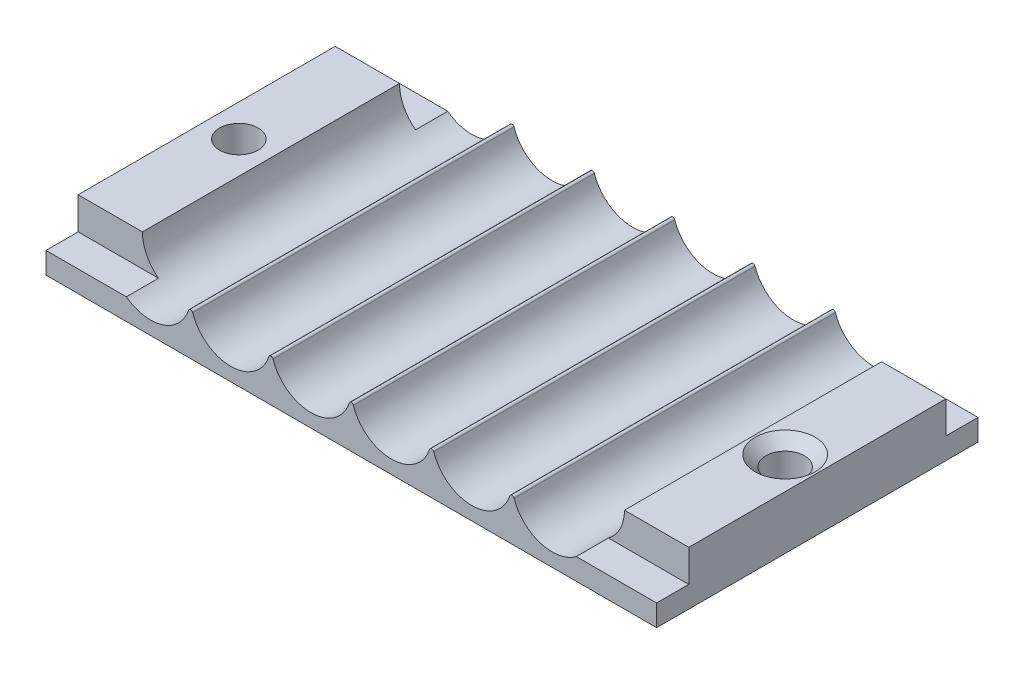
ISO-10303-21;
HEADER;
FILE_DESCRIPTION(('STEP AP214'),'2;1');
FILE_NAME('part.step','',(''),(''),'','','');
FILE_SCHEMA(('AUTOMOTIVE_DESIGN { 1 0 10303 214 1 1 1 1 }'));
ENDSEC;
DATA;
#1=APPLICATION_CONTEXT('core data for automotive mechanical design processes');
#2=APPLICATION_PROTOCOL_DEFINITION('international standard','automotive_design',2000,#1);
#3=PRODUCT_CONTEXT('',#1,'mechanical');
#4=PRODUCT('Part','Part','',(#3));
#5=PRODUCT_RELATED_PRODUCT_CATEGORY('part','',(#4));
#6=PRODUCT_DEFINITION_FORMATION('','',#4);
#7=PRODUCT_DEFINITION_CONTEXT('part definition',#1,'design');
#8=PRODUCT_DEFINITION('design','',#6,#7);
#9=PRODUCT_DEFINITION_SHAPE('','',#8);
#10=(LENGTH_UNIT() NAMED_UNIT(*) SI_UNIT(.MILLI.,.METRE.));
#11=(NAMED_UNIT(*) PLANE_ANGLE_UNIT() SI_UNIT($,.RADIAN.));
#12=(NAMED_UNIT(*) SI_UNIT($,.STERADIAN.) SOLID_ANGLE_UNIT());
#13=UNCERTAINTY_MEASURE_WITH_UNIT(LENGTH_MEASURE(1.E-05),#10,'distance_accuracy_value','');
#14=(GEOMETRIC_REPRESENTATION_CONTEXT(3) GLOBAL_UNCERTAINTY_ASSIGNED_CONTEXT((#13)) GLOBAL_UNIT_ASSIGNED_CONTEXT((#10,
#11,#12)) REPRESENTATION_CONTEXT('',''));
#15=CARTESIAN_POINT('',(0.,0.,0.));
#16=DIRECTION('',(0.,0.,1.));
#17=DIRECTION('',(1.,0.,0.));
#18=AXIS2_PLACEMENT_3D('',#15,#16,#17);
#19=CARTESIAN_POINT('',(-22.5,5.00000000000001,15.));
#20=DIRECTION('',(0.,-1.,0.));
#21=DIRECTION('',(1.,0.,0.));
#22=AXIS2_PLACEMENT_3D('',#19,#20,#21);
#23=PLANE('',#22);
#24=CARTESIAN_POINT('',(-25.5,5.00000000000001,0.));
#25=DIRECTION('',(0.,1.,0.));
#26=DIRECTION('',(-1.,0.,0.));
#27=AXIS2_PLACEMENT_3D('',#24,#25,#26);
#28=CIRCLE('',#27,1.8);
#29=CARTESIAN_POINT('',(-27.3,5.00000000000001,0.));
#30=VERTEX_POINT('',#29);
#31=EDGE_CURVE('E382',#30,#30,#28,.T.);
#32=ORIENTED_EDGE('',*,*,#31,.F.);
#33=EDGE_LOOP('',(#32));
#34=FACE_BOUND('',#33,.T.);
#35=DIRECTION('',(-1.,0.,0.));
#36=VECTOR('',#35,1.);
#37=CARTESIAN_POINT('',(-28.5,5.00000000000001,12.));
#38=LINE('',#37,#36);
#39=CARTESIAN_POINT('',(-22.5,5.00000000000001,12.));
#40=VERTEX_POINT('',#39);
#41=CARTESIAN_POINT('',(-28.5,5.00000000000001,12.));
#42=VERTEX_POINT('',#41);
#43=EDGE_CURVE('E202',#40,#42,#38,.T.);
#44=ORIENTED_EDGE('',*,*,#43,.F.);
#45=DIRECTION('',(0.,0.,-1.));
#46=VECTOR('',#45,1.);
#47=CARTESIAN_POINT('',(-22.5,5.00000000000001,15.));
#48=LINE('',#47,#46);
#49=CARTESIAN_POINT('',(-22.5,5.00000000000001,-12.));
#50=VERTEX_POINT('',#49);
#51=EDGE_CURVE('E226',#40,#50,#48,.T.);
#52=ORIENTED_EDGE('',*,*,#51,.T.);
#53=DIRECTION('',(1.,0.,0.));
#54=VECTOR('',#53,1.);
#55=CARTESIAN_POINT('',(-28.5,5.00000000000001,-12.));
#56=LINE('',#55,#54);
#57=CARTESIAN_POINT('',(-28.5,5.00000000000001,-12.));
#58=VERTEX_POINT('',#57);
#59=EDGE_CURVE('E220',#58,#50,#56,.T.);
#60=ORIENTED_EDGE('',*,*,#59,.F.);
#61=DIRECTION('',(0.,0.,-1.));
#62=VECTOR('',#61,1.);
#63=CARTESIAN_POINT('',(-28.5,5.00000000000001,15.));
#64=LINE('',#63,#62);
#65=EDGE_CURVE('E221',#42,#58,#64,.T.);
#66=ORIENTED_EDGE('',*,*,#65,.F.);
#67=EDGE_LOOP('',(#44,#52,#60,#66));
#68=FACE_BOUND('',#67,.T.);
#69=ADVANCED_FACE('F41',(#34,#68),#23,.F.);
#70=CARTESIAN_POINT('',(-28.5,5.00000000000001,15.));
#71=DIRECTION('',(1.,0.,0.));
#72=DIRECTION('',(0.,0.,-1.));
#73=AXIS2_PLACEMENT_3D('',#70,#71,#72);
#74=PLANE('',#73);
#75=DIRECTION('',(0.,0.,1.));
#76=VECTOR('',#75,1.);
#77=CARTESIAN_POINT('',(-28.5,2.00000000000001,15.));
#78=LINE('',#77,#76);
#79=CARTESIAN_POINT('',(-28.5,2.00000000000001,12.));
#80=VERTEX_POINT('',#79);
#81=CARTESIAN_POINT('',(-28.5,2.00000000000001,15.));
#82=VERTEX_POINT('',#81);
#83=EDGE_CURVE('E217',#80,#82,#78,.T.);
#84=ORIENTED_EDGE('',*,*,#83,.F.);
#85=DIRECTION('',(0.,1.,0.));
#86=VECTOR('',#85,1.);
#87=CARTESIAN_POINT('',(-28.5,2.00000000000001,12.));
#88=LINE('',#87,#86);
#89=EDGE_CURVE('E207',#80,#42,#88,.T.);
#90=ORIENTED_EDGE('',*,*,#89,.T.);
#91=ORIENTED_EDGE('',*,*,#65,.T.);
#92=DIRECTION('',(0.,1.,0.));
#93=VECTOR('',#92,1.);
#94=CARTESIAN_POINT('',(-28.5,2.00000000000001,-12.));
#95=LINE('',#94,#93);
#96=CARTESIAN_POINT('',(-28.5,2.00000000000001,-12.));
#97=VERTEX_POINT('',#96);
#98=EDGE_CURVE('E447',#97,#58,#95,.T.);
#99=ORIENTED_EDGE('',*,*,#98,.F.);
#100=DIRECTION('',(0.,0.,1.));
#101=VECTOR('',#100,1.);
#102=CARTESIAN_POINT('',(-28.5,2.00000000000001,-15.));
#103=LINE('',#102,#101);
#104=CARTESIAN_POINT('',(-28.5,2.00000000000001,-15.));
#105=VERTEX_POINT('',#104);
#106=EDGE_CURVE('E444',#105,#97,#103,.T.);
#107=ORIENTED_EDGE('',*,*,#106,.F.);
#108=DIRECTION('',(0.,-1.,0.));
#109=VECTOR('',#108,1.);
#110=CARTESIAN_POINT('',(-28.5,5.00000000000001,-15.));
#111=LINE('',#110,#109);
#112=CARTESIAN_POINT('',(-28.5,0.,-15.));
#113=VERTEX_POINT('',#112);
#114=EDGE_CURVE('E385',#105,#113,#111,.T.);
#115=ORIENTED_EDGE('',*,*,#114,.T.);
#116=DIRECTION('',(0.,0.,-1.));
#117=VECTOR('',#116,1.);
#118=CARTESIAN_POINT('',(-28.5,0.,15.));
#119=LINE('',#118,#117);
#120=CARTESIAN_POINT('',(-28.5,0.,15.));
#121=VERTEX_POINT('',#120);
#122=EDGE_CURVE('E232',#121,#113,#119,.T.);
#123=ORIENTED_EDGE('',*,*,#122,.F.);
#124=DIRECTION('',(0.,-1.,0.));
#125=VECTOR('',#124,1.);
#126=CARTESIAN_POINT('',(-28.5,5.00000000000001,15.));
#127=LINE('',#126,#125);
#128=EDGE_CURVE('E463',#82,#121,#127,.T.);
#129=ORIENTED_EDGE('',*,*,#128,.F.);
#130=EDGE_LOOP('',(#84,#90,#91,#99,#107,#115,#123,#129));
#131=FACE_BOUND('',#130,.T.);
#132=ADVANCED_FACE('F225',(#131),#74,.F.);
#133=CARTESIAN_POINT('',(28.5,5.00000000000001,15.));
#134=DIRECTION('',(-1.,0.,0.));
#135=DIRECTION('',(0.,0.,1.));
#136=AXIS2_PLACEMENT_3D('',#133,#134,#135);
#137=PLANE('',#136);
#138=DIRECTION('',(0.,0.,-1.));
#139=VECTOR('',#138,1.);
#140=CARTESIAN_POINT('',(28.5,2.00000000000002,-15.));
#141=LINE('',#140,#139);
#142=CARTESIAN_POINT('',(28.5,2.00000000000002,-12.));
#143=VERTEX_POINT('',#142);
#144=CARTESIAN_POINT('',(28.5,2.00000000000002,-15.));
#145=VERTEX_POINT('',#144);
#146=EDGE_CURVE('E438',#143,#145,#141,.T.);
#147=ORIENTED_EDGE('',*,*,#146,.F.);
#148=DIRECTION('',(0.,1.,0.));
#149=VECTOR('',#148,1.);
#150=CARTESIAN_POINT('',(28.5,2.00000000000002,-12.));
#151=LINE('',#150,#149);
#152=CARTESIAN_POINT('',(28.5,5.00000000000002,-12.));
#153=VERTEX_POINT('',#152);
#154=EDGE_CURVE('E512',#143,#153,#151,.T.);
#155=ORIENTED_EDGE('',*,*,#154,.T.);
#156=DIRECTION('',(0.,0.,-1.));
#157=VECTOR('',#156,1.);
#158=CARTESIAN_POINT('',(28.5,5.00000000000001,15.));
#159=LINE('',#158,#157);
#160=CARTESIAN_POINT('',(28.5,5.00000000000002,12.));
#161=VERTEX_POINT('',#160);
#162=EDGE_CURVE('E413',#161,#153,#159,.T.);
#163=ORIENTED_EDGE('',*,*,#162,.F.);
#164=DIRECTION('',(0.,1.,0.));
#165=VECTOR('',#164,1.);
#166=CARTESIAN_POINT('',(28.5,2.00000000000002,12.));
#167=LINE('',#166,#165);
#168=CARTESIAN_POINT('',(28.5,2.00000000000002,12.));
#169=VERTEX_POINT('',#168);
#170=EDGE_CURVE('E440',#169,#161,#167,.T.);
#171=ORIENTED_EDGE('',*,*,#170,.F.);
#172=DIRECTION('',(0.,0.,-1.));
#173=VECTOR('',#172,1.);
#174=CARTESIAN_POINT('',(28.5,2.00000000000002,15.));
#175=LINE('',#174,#173);
#176=CARTESIAN_POINT('',(28.5,2.00000000000002,15.));
#177=VERTEX_POINT('',#176);
#178=EDGE_CURVE('E518',#177,#169,#175,.T.);
#179=ORIENTED_EDGE('',*,*,#178,.F.);
#180=DIRECTION('',(0.,1.,0.));
#181=VECTOR('',#180,1.);
#182=CARTESIAN_POINT('',(28.5,5.00000000000001,15.));
#183=LINE('',#182,#181);
#184=CARTESIAN_POINT('',(28.5,0.,15.));
#185=VERTEX_POINT('',#184);
#186=EDGE_CURVE('E422',#185,#177,#183,.T.);
#187=ORIENTED_EDGE('',*,*,#186,.F.);
#188=DIRECTION('',(0.,0.,-1.));
#189=VECTOR('',#188,1.);
#190=CARTESIAN_POINT('',(28.5,0.,15.));
#191=LINE('',#190,#189);
#192=CARTESIAN_POINT('',(28.5,0.,-15.));
#193=VERTEX_POINT('',#192);
#194=EDGE_CURVE('E237',#185,#193,#191,.T.);
#195=ORIENTED_EDGE('',*,*,#194,.T.);
#196=DIRECTION('',(0.,1.,0.));
#197=VECTOR('',#196,1.);
#198=CARTESIAN_POINT('',(28.5,5.00000000000001,-15.));
#199=LINE('',#198,#197);
#200=EDGE_CURVE('E391',#193,#145,#199,.T.);
#201=ORIENTED_EDGE('',*,*,#200,.T.);
#202=EDGE_LOOP('',(#147,#155,#163,#171,#179,#187,#195,#201));
#203=FACE_BOUND('',#202,.T.);
#204=ADVANCED_FACE('F332',(#203),#137,.F.);
#205=CARTESIAN_POINT('',(22.5,5.00000000000001,15.));
#206=DIRECTION('',(0.,-1.,0.));
#207=DIRECTION('',(1.,0.,0.));
#208=AXIS2_PLACEMENT_3D('',#205,#206,#207);
#209=PLANE('',#208);
#210=CARTESIAN_POINT('',(25.5,5.00000000000001,0.));
#211=DIRECTION('',(0.,-1.,0.));
#212=DIRECTION('',(1.,0.,0.));
#213=AXIS2_PLACEMENT_3D('',#210,#211,#212);
#214=CIRCLE('',#213,2.79999999999998);
#215=CARTESIAN_POINT('',(28.3,5.00000000000001,0.));
#216=VERTEX_POINT('',#215);
#217=EDGE_CURVE('E296',#216,#216,#214,.T.);
#218=ORIENTED_EDGE('',*,*,#217,.T.);
#219=EDGE_LOOP('',(#218));
#220=FACE_BOUND('',#219,.T.);
#221=DIRECTION('',(1.,0.,0.));
#222=VECTOR('',#221,1.);
#223=CARTESIAN_POINT('',(28.5,5.00000000000002,-12.));
#224=LINE('',#223,#222);
#225=CARTESIAN_POINT('',(22.5,5.00000000000002,-12.));
#226=VERTEX_POINT('',#225);
#227=EDGE_CURVE('E432',#226,#153,#224,.T.);
#228=ORIENTED_EDGE('',*,*,#227,.F.);
#229=DIRECTION('',(0.,0.,-1.));
#230=VECTOR('',#229,1.);
#231=CARTESIAN_POINT('',(22.5,5.00000000000001,15.));
#232=LINE('',#231,#230);
#233=CARTESIAN_POINT('',(22.5,5.00000000000002,12.));
#234=VERTEX_POINT('',#233);
#235=EDGE_CURVE('E414',#234,#226,#232,.T.);
#236=ORIENTED_EDGE('',*,*,#235,.F.);
#237=DIRECTION('',(-1.,0.,0.));
#238=VECTOR('',#237,1.);
#239=CARTESIAN_POINT('',(28.5,5.00000000000002,12.));
#240=LINE('',#239,#238);
#241=EDGE_CURVE('E229',#161,#234,#240,.T.);
#242=ORIENTED_EDGE('',*,*,#241,.F.);
#243=ORIENTED_EDGE('',*,*,#162,.T.);
#244=EDGE_LOOP('',(#228,#236,#242,#243));
#245=FACE_BOUND('',#244,.T.);
#246=ADVANCED_FACE('F556',(#220,#245),#209,.F.);
#247=CARTESIAN_POINT('',(-18.75,5.00000000000001,-15.));
#248=DIRECTION('',(0.,0.,1.));
#249=DIRECTION('',(1.,0.,0.));
#250=AXIS2_PLACEMENT_3D('',#247,#248,#249);
#251=PLANE('',#250);
#252=CARTESIAN_POINT('',(11.25,5.00000000000001,-15.));
#253=DIRECTION('',(0.,0.,-1.));
#254=DIRECTION('',(1.,0.,0.));
#255=AXIS2_PLACEMENT_3D('',#252,#253,#254);
#256=CIRCLE('',#255,3.75);
#257=CARTESIAN_POINT('',(14.8101265822785,3.82186642601353,-15.));
#258=VERTEX_POINT('',#257);
#259=CARTESIAN_POINT('',(7.68987341772151,3.82186642601354,-15.));
#260=VERTEX_POINT('',#259);
#261=EDGE_CURVE('E402',#258,#260,#256,.T.);
#262=ORIENTED_EDGE('',*,*,#261,.F.);
#263=CARTESIAN_POINT('',(15.,3.75903263540092,-15.));
#264=DIRECTION('',(0.,0.,1.));
#265=DIRECTION('',(1.,0.,0.));
#266=AXIS2_PLACEMENT_3D('',#263,#264,#265);
#267=CIRCLE('',#266,0.2);
#268=CARTESIAN_POINT('',(15.1898734177215,3.82186642601353,-15.));
#269=VERTEX_POINT('',#268);
#270=EDGE_CURVE('E262',#258,#269,#267,.F.);
#271=ORIENTED_EDGE('',*,*,#270,.T.);
#272=CARTESIAN_POINT('',(18.75,5.,-15.));
#273=DIRECTION('',(0.,0.,-1.));
#274=DIRECTION('',(1.,0.,0.));
#275=AXIS2_PLACEMENT_3D('',#272,#273,#274);
#276=CIRCLE('',#275,3.75);
#277=CARTESIAN_POINT('',(21.,2.00000000000002,-15.));
#278=VERTEX_POINT('',#277);
#279=EDGE_CURVE('E400',#278,#269,#276,.T.);
#280=ORIENTED_EDGE('',*,*,#279,.F.);
#281=DIRECTION('',(-1.,0.,0.));
#282=VECTOR('',#281,1.);
#283=CARTESIAN_POINT('',(28.5,2.00000000000002,-15.));
#284=LINE('',#283,#282);
#285=EDGE_CURVE('E431',#145,#278,#284,.T.);
#286=ORIENTED_EDGE('',*,*,#285,.F.);
#287=ORIENTED_EDGE('',*,*,#200,.F.);
#288=DIRECTION('',(1.,0.,0.));
#289=VECTOR('',#288,1.);
#290=CARTESIAN_POINT('',(28.5,0.,-15.));
#291=LINE('',#290,#289);
#292=EDGE_CURVE('E384',#113,#193,#291,.T.);
#293=ORIENTED_EDGE('',*,*,#292,.F.);
#294=ORIENTED_EDGE('',*,*,#114,.F.);
#295=DIRECTION('',(-1.,0.,0.));
#296=VECTOR('',#295,1.);
#297=CARTESIAN_POINT('',(-28.5,2.00000000000001,-15.));
#298=LINE('',#297,#296);
#299=CARTESIAN_POINT('',(-21.,2.00000000000001,-15.));
#300=VERTEX_POINT('',#299);
#301=EDGE_CURVE('E235',#300,#105,#298,.T.);
#302=ORIENTED_EDGE('',*,*,#301,.F.);
#303=CARTESIAN_POINT('',(-18.75,5.00000000000001,-15.));
#304=DIRECTION('',(0.,0.,-1.));
#305=DIRECTION('',(1.,0.,0.));
#306=AXIS2_PLACEMENT_3D('',#303,#304,#305);
#307=CIRCLE('',#306,3.75);
#308=CARTESIAN_POINT('',(-15.1898734177215,3.82186642601354,-15.));
#309=VERTEX_POINT('',#308);
#310=EDGE_CURVE('E373',#309,#300,#307,.T.);
#311=ORIENTED_EDGE('',*,*,#310,.F.);
#312=CARTESIAN_POINT('',(-15.,3.75903263540093,-15.));
#313=DIRECTION('',(0.,0.,1.));
#314=DIRECTION('',(1.,0.,0.));
#315=AXIS2_PLACEMENT_3D('',#312,#313,#314);
#316=CIRCLE('',#315,0.2);
#317=CARTESIAN_POINT('',(-14.8101265822785,3.82186642601354,-15.));
#318=VERTEX_POINT('',#317);
#319=EDGE_CURVE('E258',#309,#318,#316,.F.);
#320=ORIENTED_EDGE('',*,*,#319,.T.);
#321=CARTESIAN_POINT('',(-11.25,5.00000000000001,-15.));
#322=DIRECTION('',(0.,0.,-1.));
#323=DIRECTION('',(1.,0.,0.));
#324=AXIS2_PLACEMENT_3D('',#321,#322,#323);
#325=CIRCLE('',#324,3.75);
#326=CARTESIAN_POINT('',(-7.68987341772152,3.82186642601354,-15.));
#327=VERTEX_POINT('',#326);
#328=EDGE_CURVE('E406',#327,#318,#325,.T.);
#329=ORIENTED_EDGE('',*,*,#328,.F.);
#330=CARTESIAN_POINT('',(-7.5,3.75903263540093,-15.));
#331=DIRECTION('',(0.,0.,1.));
#332=DIRECTION('',(1.,0.,0.));
#333=AXIS2_PLACEMENT_3D('',#330,#331,#332);
#334=CIRCLE('',#333,0.2);
#335=CARTESIAN_POINT('',(-7.31012658227849,3.82186642601354,-15.));
#336=VERTEX_POINT('',#335);
#337=EDGE_CURVE('E256',#327,#336,#334,.F.);
#338=ORIENTED_EDGE('',*,*,#337,.T.);
#339=CARTESIAN_POINT('',(-3.75,5.00000000000001,-15.));
#340=DIRECTION('',(0.,0.,-1.));
#341=DIRECTION('',(1.,0.,0.));
#342=AXIS2_PLACEMENT_3D('',#339,#340,#341);
#343=CIRCLE('',#342,3.75);
#344=CARTESIAN_POINT('',(-0.189873417721522,3.82186642601354,-15.));
#345=VERTEX_POINT('',#344);
#346=EDGE_CURVE('E409',#345,#336,#343,.T.);
#347=ORIENTED_EDGE('',*,*,#346,.F.);
#348=CARTESIAN_POINT('',(0.,3.75903263540093,-15.));
#349=DIRECTION('',(0.,0.,1.));
#350=DIRECTION('',(1.,0.,0.));
#351=AXIS2_PLACEMENT_3D('',#348,#349,#350);
#352=CIRCLE('',#351,0.2);
#353=CARTESIAN_POINT('',(0.189873417721515,3.82186642601354,-15.));
#354=VERTEX_POINT('',#353);
#355=EDGE_CURVE('E257',#345,#354,#352,.F.);
#356=ORIENTED_EDGE('',*,*,#355,.T.);
#357=CARTESIAN_POINT('',(3.75,5.00000000000001,-15.));
#358=DIRECTION('',(0.,0.,-1.));
#359=DIRECTION('',(1.,0.,0.));
#360=AXIS2_PLACEMENT_3D('',#357,#358,#359);
#361=CIRCLE('',#360,3.75);
#362=CARTESIAN_POINT('',(7.31012658227848,3.82186642601354,-15.));
#363=VERTEX_POINT('',#362);
#364=EDGE_CURVE('E404',#363,#354,#361,.T.);
#365=ORIENTED_EDGE('',*,*,#364,.F.);
#366=CARTESIAN_POINT('',(7.5,3.75903263540093,-15.));
#367=DIRECTION('',(0.,0.,1.));
#368=DIRECTION('',(1.,0.,0.));
#369=AXIS2_PLACEMENT_3D('',#366,#367,#368);
#370=CIRCLE('',#369,0.2);
#371=EDGE_CURVE('E265',#363,#260,#370,.F.);
#372=ORIENTED_EDGE('',*,*,#371,.T.);
#373=EDGE_LOOP('',(#262,#271,#280,#286,#287,#293,#294,#302,#311,#320,#329,#338,#347,#356,#365,#372));
#374=FACE_BOUND('',#373,.T.);
#375=ADVANCED_FACE('F340',(#374),#251,.F.);
#376=CARTESIAN_POINT('',(-18.75,5.00000000000001,15.));
#377=DIRECTION('',(0.,0.,-1.));
#378=DIRECTION('',(-1.,0.,0.));
#379=AXIS2_PLACEMENT_3D('',#376,#377,#378);
#380=CYLINDRICAL_SURFACE('',#379,3.75);
#381=CARTESIAN_POINT('',(-18.75,5.00000000000001,15.));
#382=DIRECTION('',(0.,0.,-1.));
#383=DIRECTION('',(1.,0.,0.));
#384=AXIS2_PLACEMENT_3D('',#381,#382,#383);
#385=CIRCLE('',#384,3.75);
#386=CARTESIAN_POINT('',(-15.1898734177215,3.82186642601354,15.));
#387=VERTEX_POINT('',#386);
#388=CARTESIAN_POINT('',(-21.,2.00000000000001,15.));
#389=VERTEX_POINT('',#388);
#390=EDGE_CURVE('E376',#387,#389,#385,.T.);
#391=ORIENTED_EDGE('',*,*,#390,.F.);
#392=DIRECTION('',(0.,0.,-1.));
#393=VECTOR('',#392,1.);
#394=CARTESIAN_POINT('',(-15.1898734177215,3.82186642601354,15.));
#395=LINE('',#394,#393);
#396=EDGE_CURVE('E292',#387,#309,#395,.T.);
#397=ORIENTED_EDGE('',*,*,#396,.T.);
#398=ORIENTED_EDGE('',*,*,#310,.T.);
#399=DIRECTION('',(0.,0.,-1.));
#400=VECTOR('',#399,1.);
#401=CARTESIAN_POINT('',(-21.,2.00000000000001,15.));
#402=LINE('',#401,#400);
#403=CARTESIAN_POINT('',(-21.,2.00000000000001,-12.));
#404=VERTEX_POINT('',#403);
#405=EDGE_CURVE('E454',#404,#300,#402,.T.);
#406=ORIENTED_EDGE('',*,*,#405,.F.);
#407=CARTESIAN_POINT('',(-18.75,5.00000000000001,-12.));
#408=DIRECTION('',(0.,0.,1.));
#409=DIRECTION('',(1.,0.,0.));
#410=AXIS2_PLACEMENT_3D('',#407,#408,#409);
#411=CIRCLE('',#410,3.75);
#412=EDGE_CURVE('E249',#404,#50,#411,.F.);
#413=ORIENTED_EDGE('',*,*,#412,.T.);
#414=ORIENTED_EDGE('',*,*,#51,.F.);
#415=CARTESIAN_POINT('',(-18.75,5.00000000000001,12.));
#416=DIRECTION('',(0.,0.,-1.));
#417=DIRECTION('',(-1.,0.,0.));
#418=AXIS2_PLACEMENT_3D('',#415,#416,#417);
#419=CIRCLE('',#418,3.75);
#420=CARTESIAN_POINT('',(-21.,2.00000000000001,12.));
#421=VERTEX_POINT('',#420);
#422=EDGE_CURVE('E215',#40,#421,#419,.F.);
#423=ORIENTED_EDGE('',*,*,#422,.T.);
#424=DIRECTION('',(0.,0.,-1.));
#425=VECTOR('',#424,1.);
#426=CARTESIAN_POINT('',(-21.,2.00000000000001,15.));
#427=LINE('',#426,#425);
#428=EDGE_CURVE('E457',#421,#389,#427,.F.);
#429=ORIENTED_EDGE('',*,*,#428,.T.);
#430=EDGE_LOOP('',(#391,#397,#398,#406,#413,#414,#423,#429));
#431=FACE_BOUND('',#430,.T.);
#432=ADVANCED_FACE('F338',(#431),#380,.F.);
#433=CARTESIAN_POINT('',(28.5,0.,15.));
#434=DIRECTION('',(0.,1.,0.));
#435=DIRECTION('',(-1.,0.,0.));
#436=AXIS2_PLACEMENT_3D('',#433,#434,#435);
#437=PLANE('',#436);
#438=CARTESIAN_POINT('',(25.5,0.,0.));
#439=DIRECTION('',(0.,1.,0.));
#440=DIRECTION('',(-1.,0.,0.));
#441=AXIS2_PLACEMENT_3D('',#438,#439,#440);
#442=CIRCLE('',#441,2.8);
#443=CARTESIAN_POINT('',(22.7,0.,0.));
#444=VERTEX_POINT('',#443);
#445=EDGE_CURVE('E49',#444,#444,#442,.T.);
#446=ORIENTED_EDGE('',*,*,#445,.T.);
#447=EDGE_LOOP('',(#446));
#448=FACE_BOUND('',#447,.T.);
#449=CARTESIAN_POINT('',(-25.5,0.,0.));
#450=DIRECTION('',(0.,1.,0.));
#451=DIRECTION('',(-1.,0.,0.));
#452=AXIS2_PLACEMENT_3D('',#449,#450,#451);
#453=CIRCLE('',#452,2.79999999999994);
#454=CARTESIAN_POINT('',(-28.2999999999999,0.,0.));
#455=VERTEX_POINT('',#454);
#456=EDGE_CURVE('E305',#455,#455,#453,.T.);
#457=ORIENTED_EDGE('',*,*,#456,.T.);
#458=EDGE_LOOP('',(#457));
#459=FACE_BOUND('',#458,.T.);
#460=ORIENTED_EDGE('',*,*,#292,.T.);
#461=ORIENTED_EDGE('',*,*,#194,.F.);
#462=DIRECTION('',(1.,0.,0.));
#463=VECTOR('',#462,1.);
#464=CARTESIAN_POINT('',(-28.5,0.,15.));
#465=LINE('',#464,#463);
#466=EDGE_CURVE('E462',#121,#185,#465,.T.);
#467=ORIENTED_EDGE('',*,*,#466,.F.);
#468=ORIENTED_EDGE('',*,*,#122,.T.);
#469=EDGE_LOOP('',(#460,#461,#467,#468));
#470=FACE_BOUND('',#469,.T.);
#471=ADVANCED_FACE('F306',(#448,#459,#470),#437,.F.);
#472=CARTESIAN_POINT('',(18.75,5.,15.));
#473=DIRECTION('',(0.,0.,-1.));
#474=DIRECTION('',(-1.,0.,0.));
#475=AXIS2_PLACEMENT_3D('',#472,#473,#474);
#476=CYLINDRICAL_SURFACE('',#475,3.75);
#477=ORIENTED_EDGE('',*,*,#279,.T.);
#478=DIRECTION('',(0.,0.,-1.));
#479=VECTOR('',#478,1.);
#480=CARTESIAN_POINT('',(15.1898734177215,3.82186642601353,15.));
#481=LINE('',#480,#479);
#482=CARTESIAN_POINT('',(15.1898734177215,3.82186642601353,15.));
#483=VERTEX_POINT('',#482);
#484=EDGE_CURVE('E266',#269,#483,#481,.F.);
#485=ORIENTED_EDGE('',*,*,#484,.T.);
#486=CARTESIAN_POINT('',(18.75,5.,15.));
#487=DIRECTION('',(0.,0.,-1.));
#488=DIRECTION('',(1.,0.,0.));
#489=AXIS2_PLACEMENT_3D('',#486,#487,#488);
#490=CIRCLE('',#489,3.75);
#491=CARTESIAN_POINT('',(21.,2.00000000000002,15.));
#492=VERTEX_POINT('',#491);
#493=EDGE_CURVE('E467',#492,#483,#490,.T.);
#494=ORIENTED_EDGE('',*,*,#493,.F.);
#495=DIRECTION('',(0.,0.,-1.));
#496=VECTOR('',#495,1.);
#497=CARTESIAN_POINT('',(21.,2.00000000000002,15.));
#498=LINE('',#497,#496);
#499=CARTESIAN_POINT('',(21.,2.00000000000002,12.));
#500=VERTEX_POINT('',#499);
#501=EDGE_CURVE('E389',#492,#500,#498,.T.);
#502=ORIENTED_EDGE('',*,*,#501,.T.);
#503=CARTESIAN_POINT('',(18.75,5.,12.));
#504=DIRECTION('',(0.,0.,-1.));
#505=DIRECTION('',(-1.,0.,0.));
#506=AXIS2_PLACEMENT_3D('',#503,#504,#505);
#507=CIRCLE('',#506,3.75);
#508=EDGE_CURVE('E238',#500,#234,#507,.F.);
#509=ORIENTED_EDGE('',*,*,#508,.T.);
#510=ORIENTED_EDGE('',*,*,#235,.T.);
#511=CARTESIAN_POINT('',(18.75,5.,-12.));
#512=DIRECTION('',(0.,0.,1.));
#513=DIRECTION('',(1.,0.,0.));
#514=AXIS2_PLACEMENT_3D('',#511,#512,#513);
#515=CIRCLE('',#514,3.75);
#516=CARTESIAN_POINT('',(21.,2.00000000000002,-12.));
#517=VERTEX_POINT('',#516);
#518=EDGE_CURVE('E242',#226,#517,#515,.F.);
#519=ORIENTED_EDGE('',*,*,#518,.T.);
#520=DIRECTION('',(0.,0.,-1.));
#521=VECTOR('',#520,1.);
#522=CARTESIAN_POINT('',(21.,2.00000000000002,15.));
#523=LINE('',#522,#521);
#524=EDGE_CURVE('E451',#278,#517,#523,.F.);
#525=ORIENTED_EDGE('',*,*,#524,.F.);
#526=EDGE_LOOP('',(#477,#485,#494,#502,#509,#510,#519,#525));
#527=FACE_BOUND('',#526,.T.);
#528=ADVANCED_FACE('F504',(#527),#476,.F.);
#529=CARTESIAN_POINT('',(11.25,5.00000000000001,15.));
#530=DIRECTION('',(0.,0.,-1.));
#531=DIRECTION('',(-1.,0.,0.));
#532=AXIS2_PLACEMENT_3D('',#529,#530,#531);
#533=CYLINDRICAL_SURFACE('',#532,3.75);
#534=CARTESIAN_POINT('',(11.25,5.00000000000001,15.));
#535=DIRECTION('',(0.,0.,-1.));
#536=DIRECTION('',(1.,0.,0.));
#537=AXIS2_PLACEMENT_3D('',#534,#535,#536);
#538=CIRCLE('',#537,3.75);
#539=CARTESIAN_POINT('',(14.8101265822785,3.82186642601353,15.));
#540=VERTEX_POINT('',#539);
#541=CARTESIAN_POINT('',(7.68987341772151,3.82186642601354,15.));
#542=VERTEX_POINT('',#541);
#543=EDGE_CURVE('E466',#540,#542,#538,.T.);
#544=ORIENTED_EDGE('',*,*,#543,.F.);
#545=DIRECTION('',(0.,0.,-1.));
#546=VECTOR('',#545,1.);
#547=CARTESIAN_POINT('',(14.8101265822785,3.82186642601353,15.));
#548=LINE('',#547,#546);
#549=EDGE_CURVE('E251',#540,#258,#548,.T.);
#550=ORIENTED_EDGE('',*,*,#549,.T.);
#551=ORIENTED_EDGE('',*,*,#261,.T.);
#552=DIRECTION('',(0.,0.,-1.));
#553=VECTOR('',#552,1.);
#554=CARTESIAN_POINT('',(7.68987341772151,3.82186642601354,15.));
#555=LINE('',#554,#553);
#556=EDGE_CURVE('E253',#260,#542,#555,.F.);
#557=ORIENTED_EDGE('',*,*,#556,.T.);
#558=EDGE_LOOP('',(#544,#550,#551,#557));
#559=FACE_BOUND('',#558,.T.);
#560=ADVANCED_FACE('F500',(#559),#533,.F.);
#561=CARTESIAN_POINT('',(3.75,5.00000000000001,15.));
#562=DIRECTION('',(0.,0.,-1.));
#563=DIRECTION('',(-1.,0.,0.));
#564=AXIS2_PLACEMENT_3D('',#561,#562,#563);
#565=CYLINDRICAL_SURFACE('',#564,3.75);
#566=CARTESIAN_POINT('',(3.75,5.00000000000001,15.));
#567=DIRECTION('',(0.,0.,-1.));
#568=DIRECTION('',(1.,0.,0.));
#569=AXIS2_PLACEMENT_3D('',#566,#567,#568);
#570=CIRCLE('',#569,3.75);
#571=CARTESIAN_POINT('',(7.31012658227848,3.82186642601354,15.));
#572=VERTEX_POINT('',#571);
#573=CARTESIAN_POINT('',(0.189873417721515,3.82186642601354,15.));
#574=VERTEX_POINT('',#573);
#575=EDGE_CURVE('E472',#572,#574,#570,.T.);
#576=ORIENTED_EDGE('',*,*,#575,.F.);
#577=DIRECTION('',(0.,0.,-1.));
#578=VECTOR('',#577,1.);
#579=CARTESIAN_POINT('',(7.31012658227848,3.82186642601354,15.));
#580=LINE('',#579,#578);
#581=EDGE_CURVE('E276',#572,#363,#580,.T.);
#582=ORIENTED_EDGE('',*,*,#581,.T.);
#583=ORIENTED_EDGE('',*,*,#364,.T.);
#584=DIRECTION('',(0.,0.,-1.));
#585=VECTOR('',#584,1.);
#586=CARTESIAN_POINT('',(0.189873417721515,3.82186642601354,15.));
#587=LINE('',#586,#585);
#588=EDGE_CURVE('E280',#354,#574,#587,.F.);
#589=ORIENTED_EDGE('',*,*,#588,.T.);
#590=EDGE_LOOP('',(#576,#582,#583,#589));
#591=FACE_BOUND('',#590,.T.);
#592=ADVANCED_FACE('F491',(#591),#565,.F.);
#593=CARTESIAN_POINT('',(-3.75,5.00000000000001,15.));
#594=DIRECTION('',(0.,0.,-1.));
#595=DIRECTION('',(-1.,0.,0.));
#596=AXIS2_PLACEMENT_3D('',#593,#594,#595);
#597=CYLINDRICAL_SURFACE('',#596,3.75);
#598=CARTESIAN_POINT('',(-3.75,5.00000000000001,15.));
#599=DIRECTION('',(0.,0.,-1.));
#600=DIRECTION('',(1.,0.,0.));
#601=AXIS2_PLACEMENT_3D('',#598,#599,#600);
#602=CIRCLE('',#601,3.75);
#603=CARTESIAN_POINT('',(-0.189873417721522,3.82186642601354,15.));
#604=VERTEX_POINT('',#603);
#605=CARTESIAN_POINT('',(-7.31012658227849,3.82186642601354,15.));
#606=VERTEX_POINT('',#605);
#607=EDGE_CURVE('E475',#604,#606,#602,.T.);
#608=ORIENTED_EDGE('',*,*,#607,.F.);
#609=DIRECTION('',(0.,0.,-1.));
#610=VECTOR('',#609,1.);
#611=CARTESIAN_POINT('',(-0.189873417721522,3.82186642601354,15.));
#612=LINE('',#611,#610);
#613=EDGE_CURVE('E285',#604,#345,#612,.T.);
#614=ORIENTED_EDGE('',*,*,#613,.T.);
#615=ORIENTED_EDGE('',*,*,#346,.T.);
#616=DIRECTION('',(0.,0.,-1.));
#617=VECTOR('',#616,1.);
#618=CARTESIAN_POINT('',(-7.31012658227849,3.82186642601354,15.));
#619=LINE('',#618,#617);
#620=EDGE_CURVE('E284',#336,#606,#619,.F.);
#621=ORIENTED_EDGE('',*,*,#620,.T.);
#622=EDGE_LOOP('',(#608,#614,#615,#621));
#623=FACE_BOUND('',#622,.T.);
#624=ADVANCED_FACE('F482',(#623),#597,.F.);
#625=CARTESIAN_POINT('',(-11.25,5.00000000000001,15.));
#626=DIRECTION('',(0.,0.,-1.));
#627=DIRECTION('',(-1.,0.,0.));
#628=AXIS2_PLACEMENT_3D('',#625,#626,#627);
#629=CYLINDRICAL_SURFACE('',#628,3.75);
#630=CARTESIAN_POINT('',(-11.25,5.00000000000001,15.));
#631=DIRECTION('',(0.,0.,-1.));
#632=DIRECTION('',(1.,0.,0.));
#633=AXIS2_PLACEMENT_3D('',#630,#631,#632);
#634=CIRCLE('',#633,3.75);
#635=CARTESIAN_POINT('',(-7.68987341772152,3.82186642601354,15.));
#636=VERTEX_POINT('',#635);
#637=CARTESIAN_POINT('',(-14.8101265822785,3.82186642601354,15.));
#638=VERTEX_POINT('',#637);
#639=EDGE_CURVE('E393',#636,#638,#634,.T.);
#640=ORIENTED_EDGE('',*,*,#639,.F.);
#641=DIRECTION('',(0.,0.,-1.));
#642=VECTOR('',#641,1.);
#643=CARTESIAN_POINT('',(-7.68987341772152,3.82186642601354,15.));
#644=LINE('',#643,#642);
#645=EDGE_CURVE('E290',#636,#327,#644,.T.);
#646=ORIENTED_EDGE('',*,*,#645,.T.);
#647=ORIENTED_EDGE('',*,*,#328,.T.);
#648=DIRECTION('',(0.,0.,-1.));
#649=VECTOR('',#648,1.);
#650=CARTESIAN_POINT('',(-14.8101265822785,3.82186642601354,15.));
#651=LINE('',#650,#649);
#652=EDGE_CURVE('E61',#318,#638,#651,.F.);
#653=ORIENTED_EDGE('',*,*,#652,.T.);
#654=EDGE_LOOP('',(#640,#646,#647,#653));
#655=FACE_BOUND('',#654,.T.);
#656=ADVANCED_FACE('F477',(#655),#629,.F.);
#657=CARTESIAN_POINT('',(-18.75,5.00000000000001,15.));
#658=DIRECTION('',(0.,0.,1.));
#659=DIRECTION('',(1.,0.,0.));
#660=AXIS2_PLACEMENT_3D('',#657,#658,#659);
#661=PLANE('',#660);
#662=ORIENTED_EDGE('',*,*,#493,.T.);
#663=CARTESIAN_POINT('',(15.,3.75903263540092,15.));
#664=DIRECTION('',(0.,0.,1.));
#665=DIRECTION('',(1.,0.,0.));
#666=AXIS2_PLACEMENT_3D('',#663,#664,#665);
#667=CIRCLE('',#666,0.2);
#668=EDGE_CURVE('E274',#483,#540,#667,.T.);
#669=ORIENTED_EDGE('',*,*,#668,.T.);
#670=ORIENTED_EDGE('',*,*,#543,.T.);
#671=CARTESIAN_POINT('',(7.5,3.75903263540093,15.));
#672=DIRECTION('',(0.,0.,1.));
#673=DIRECTION('',(1.,0.,0.));
#674=AXIS2_PLACEMENT_3D('',#671,#672,#673);
#675=CIRCLE('',#674,0.2);
#676=EDGE_CURVE('E272',#542,#572,#675,.T.);
#677=ORIENTED_EDGE('',*,*,#676,.T.);
#678=ORIENTED_EDGE('',*,*,#575,.T.);
#679=CARTESIAN_POINT('',(0.,3.75903263540093,15.));
#680=DIRECTION('',(0.,0.,1.));
#681=DIRECTION('',(1.,0.,0.));
#682=AXIS2_PLACEMENT_3D('',#679,#680,#681);
#683=CIRCLE('',#682,0.2);
#684=EDGE_CURVE('E271',#574,#604,#683,.T.);
#685=ORIENTED_EDGE('',*,*,#684,.T.);
#686=ORIENTED_EDGE('',*,*,#607,.T.);
#687=CARTESIAN_POINT('',(-7.5,3.75903263540093,15.));
#688=DIRECTION('',(0.,0.,1.));
#689=DIRECTION('',(1.,0.,0.));
#690=AXIS2_PLACEMENT_3D('',#687,#688,#689);
#691=CIRCLE('',#690,0.2);
#692=EDGE_CURVE('E267',#606,#636,#691,.T.);
#693=ORIENTED_EDGE('',*,*,#692,.T.);
#694=ORIENTED_EDGE('',*,*,#639,.T.);
#695=CARTESIAN_POINT('',(-15.,3.75903263540093,15.));
#696=DIRECTION('',(0.,0.,1.));
#697=DIRECTION('',(1.,0.,0.));
#698=AXIS2_PLACEMENT_3D('',#695,#696,#697);
#699=CIRCLE('',#698,0.2);
#700=EDGE_CURVE('E60',#638,#387,#699,.T.);
#701=ORIENTED_EDGE('',*,*,#700,.T.);
#702=ORIENTED_EDGE('',*,*,#390,.T.);
#703=DIRECTION('',(1.,0.,0.));
#704=VECTOR('',#703,1.);
#705=CARTESIAN_POINT('',(-28.5,2.00000000000001,15.));
#706=LINE('',#705,#704);
#707=EDGE_CURVE('E521',#82,#389,#706,.T.);
#708=ORIENTED_EDGE('',*,*,#707,.F.);
#709=ORIENTED_EDGE('',*,*,#128,.T.);
#710=ORIENTED_EDGE('',*,*,#466,.T.);
#711=ORIENTED_EDGE('',*,*,#186,.T.);
#712=DIRECTION('',(1.,0.,0.));
#713=VECTOR('',#712,1.);
#714=CARTESIAN_POINT('',(28.5,2.00000000000002,15.));
#715=LINE('',#714,#713);
#716=EDGE_CURVE('E245',#492,#177,#715,.T.);
#717=ORIENTED_EDGE('',*,*,#716,.F.);
#718=EDGE_LOOP('',(#662,#669,#670,#677,#678,#685,#686,#693,#694,#701,#702,#708,#709,#710,#711,#717));
#719=FACE_BOUND('',#718,.T.);
#720=ADVANCED_FACE('F476',(#719),#661,.T.);
#721=CARTESIAN_POINT('',(25.5,0.,0.));
#722=DIRECTION('',(0.,1.,0.));
#723=DIRECTION('',(-1.,0.,0.));
#724=AXIS2_PLACEMENT_3D('',#721,#722,#723);
#725=CYLINDRICAL_SURFACE('',#724,1.8);
#726=CARTESIAN_POINT('',(25.5,4.00000000000002,0.));
#727=DIRECTION('',(0.,-1.,0.));
#728=DIRECTION('',(0.,0.,-1.));
#729=AXIS2_PLACEMENT_3D('',#726,#727,#728);
#730=CIRCLE('',#729,1.8);
#731=CARTESIAN_POINT('',(25.5,4.00000000000002,-1.8));
#732=VERTEX_POINT('',#731);
#733=EDGE_CURVE('E299',#732,#732,#730,.F.);
#734=ORIENTED_EDGE('',*,*,#733,.T.);
#735=EDGE_LOOP('',(#734));
#736=FACE_BOUND('',#735,.T.);
#737=CARTESIAN_POINT('',(25.5,1.,0.));
#738=DIRECTION('',(0.,1.,0.));
#739=DIRECTION('',(0.,0.,1.));
#740=AXIS2_PLACEMENT_3D('',#737,#738,#739);
#741=CIRCLE('',#740,1.8);
#742=CARTESIAN_POINT('',(25.5,1.,1.8));
#743=VERTEX_POINT('',#742);
#744=EDGE_CURVE('E294',#743,#743,#741,.F.);
#745=ORIENTED_EDGE('',*,*,#744,.T.);
#746=EDGE_LOOP('',(#745));
#747=FACE_BOUND('',#746,.T.);
#748=ADVANCED_FACE('F552',(#736,#747),#725,.F.);
#749=CARTESIAN_POINT('',(-25.5,0.,0.));
#750=DIRECTION('',(0.,1.,0.));
#751=DIRECTION('',(-1.,0.,0.));
#752=AXIS2_PLACEMENT_3D('',#749,#750,#751);
#753=CYLINDRICAL_SURFACE('',#752,1.8);
#754=CARTESIAN_POINT('',(-25.5,0.999999999999985,0.));
#755=DIRECTION('',(0.,1.,0.));
#756=DIRECTION('',(0.,0.,1.));
#757=AXIS2_PLACEMENT_3D('',#754,#755,#756);
#758=CIRCLE('',#757,1.8);
#759=CARTESIAN_POINT('',(-25.5,0.999999999999985,1.8));
#760=VERTEX_POINT('',#759);
#761=EDGE_CURVE('E11',#760,#760,#758,.F.);
#762=ORIENTED_EDGE('',*,*,#761,.T.);
#763=EDGE_LOOP('',(#762));
#764=FACE_BOUND('',#763,.T.);
#765=ORIENTED_EDGE('',*,*,#31,.T.);
#766=EDGE_LOOP('',(#765));
#767=FACE_BOUND('',#766,.T.);
#768=ADVANCED_FACE('F550',(#764,#767),#753,.F.);
#769=CARTESIAN_POINT('',(28.5,2.00000000000002,12.));
#770=DIRECTION('',(0.,0.,-1.));
#771=DIRECTION('',(-1.,0.,0.));
#772=AXIS2_PLACEMENT_3D('',#769,#770,#771);
#773=PLANE('',#772);
#774=DIRECTION('',(-1.,0.,0.));
#775=VECTOR('',#774,1.);
#776=CARTESIAN_POINT('',(28.5,2.00000000000002,12.));
#777=LINE('',#776,#775);
#778=EDGE_CURVE('E520',#169,#500,#777,.T.);
#779=ORIENTED_EDGE('',*,*,#778,.F.);
#780=ORIENTED_EDGE('',*,*,#170,.T.);
#781=ORIENTED_EDGE('',*,*,#241,.T.);
#782=ORIENTED_EDGE('',*,*,#508,.F.);
#783=EDGE_LOOP('',(#779,#780,#781,#782));
#784=FACE_BOUND('',#783,.T.);
#785=ADVANCED_FACE('F549',(#784),#773,.F.);
#786=CARTESIAN_POINT('',(0.,2.00000000000001,0.));
#787=DIRECTION('',(0.,-1.,0.));
#788=DIRECTION('',(1.,0.,0.));
#789=AXIS2_PLACEMENT_3D('',#786,#787,#788);
#790=PLANE('',#789);
#791=ORIENTED_EDGE('',*,*,#716,.T.);
#792=ORIENTED_EDGE('',*,*,#178,.T.);
#793=ORIENTED_EDGE('',*,*,#778,.T.);
#794=ORIENTED_EDGE('',*,*,#501,.F.);
#795=EDGE_LOOP('',(#791,#792,#793,#794));
#796=FACE_BOUND('',#795,.T.);
#797=ADVANCED_FACE('F677',(#796),#790,.F.);
#798=CARTESIAN_POINT('',(28.5,2.00000000000002,-12.));
#799=DIRECTION('',(0.,0.,1.));
#800=DIRECTION('',(1.,0.,0.));
#801=AXIS2_PLACEMENT_3D('',#798,#799,#800);
#802=PLANE('',#801);
#803=ORIENTED_EDGE('',*,*,#227,.T.);
#804=ORIENTED_EDGE('',*,*,#154,.F.);
#805=DIRECTION('',(1.,0.,0.));
#806=VECTOR('',#805,1.);
#807=CARTESIAN_POINT('',(28.5,2.00000000000002,-12.));
#808=LINE('',#807,#806);
#809=EDGE_CURVE('E434',#517,#143,#808,.T.);
#810=ORIENTED_EDGE('',*,*,#809,.F.);
#811=ORIENTED_EDGE('',*,*,#518,.F.);
#812=EDGE_LOOP('',(#803,#804,#810,#811));
#813=FACE_BOUND('',#812,.T.);
#814=ADVANCED_FACE('F510',(#813),#802,.F.);
#815=CARTESIAN_POINT('',(0.,2.00000000000001,0.));
#816=DIRECTION('',(0.,1.,0.));
#817=DIRECTION('',(-1.,0.,0.));
#818=AXIS2_PLACEMENT_3D('',#815,#816,#817);
#819=PLANE('',#818);
#820=ORIENTED_EDGE('',*,*,#524,.T.);
#821=ORIENTED_EDGE('',*,*,#809,.T.);
#822=ORIENTED_EDGE('',*,*,#146,.T.);
#823=ORIENTED_EDGE('',*,*,#285,.T.);
#824=EDGE_LOOP('',(#820,#821,#822,#823));
#825=FACE_BOUND('',#824,.T.);
#826=ADVANCED_FACE('F501',(#825),#819,.T.);
#827=CARTESIAN_POINT('',(-28.5,2.00000000000001,-12.));
#828=DIRECTION('',(0.,0.,1.));
#829=DIRECTION('',(1.,0.,0.));
#830=AXIS2_PLACEMENT_3D('',#827,#828,#829);
#831=PLANE('',#830);
#832=DIRECTION('',(1.,0.,0.));
#833=VECTOR('',#832,1.);
#834=CARTESIAN_POINT('',(-28.5,2.00000000000001,-12.));
#835=LINE('',#834,#833);
#836=EDGE_CURVE('E448',#97,#404,#835,.T.);
#837=ORIENTED_EDGE('',*,*,#836,.F.);
#838=ORIENTED_EDGE('',*,*,#98,.T.);
#839=ORIENTED_EDGE('',*,*,#59,.T.);
#840=ORIENTED_EDGE('',*,*,#412,.F.);
#841=EDGE_LOOP('',(#837,#838,#839,#840));
#842=FACE_BOUND('',#841,.T.);
#843=ADVANCED_FACE('F533',(#842),#831,.F.);
#844=CARTESIAN_POINT('',(0.,2.00000000000002,0.));
#845=DIRECTION('',(0.,1.,0.));
#846=DIRECTION('',(-1.,0.,0.));
#847=AXIS2_PLACEMENT_3D('',#844,#845,#846);
#848=PLANE('',#847);
#849=ORIENTED_EDGE('',*,*,#405,.T.);
#850=ORIENTED_EDGE('',*,*,#301,.T.);
#851=ORIENTED_EDGE('',*,*,#106,.T.);
#852=ORIENTED_EDGE('',*,*,#836,.T.);
#853=EDGE_LOOP('',(#849,#850,#851,#852));
#854=FACE_BOUND('',#853,.T.);
#855=ADVANCED_FACE('F532',(#854),#848,.T.);
#856=CARTESIAN_POINT('',(-28.5,2.00000000000001,12.));
#857=DIRECTION('',(0.,0.,-1.));
#858=DIRECTION('',(-1.,0.,0.));
#859=AXIS2_PLACEMENT_3D('',#856,#857,#858);
#860=PLANE('',#859);
#861=ORIENTED_EDGE('',*,*,#43,.T.);
#862=ORIENTED_EDGE('',*,*,#89,.F.);
#863=DIRECTION('',(-1.,0.,0.));
#864=VECTOR('',#863,1.);
#865=CARTESIAN_POINT('',(-28.5,2.00000000000001,12.));
#866=LINE('',#865,#864);
#867=EDGE_CURVE('E228',#421,#80,#866,.T.);
#868=ORIENTED_EDGE('',*,*,#867,.F.);
#869=ORIENTED_EDGE('',*,*,#422,.F.);
#870=EDGE_LOOP('',(#861,#862,#868,#869));
#871=FACE_BOUND('',#870,.T.);
#872=ADVANCED_FACE('F210',(#871),#860,.F.);
#873=CARTESIAN_POINT('',(0.,2.00000000000002,0.));
#874=DIRECTION('',(0.,-1.,0.));
#875=DIRECTION('',(1.,0.,0.));
#876=AXIS2_PLACEMENT_3D('',#873,#874,#875);
#877=PLANE('',#876);
#878=ORIENTED_EDGE('',*,*,#867,.T.);
#879=ORIENTED_EDGE('',*,*,#83,.T.);
#880=ORIENTED_EDGE('',*,*,#707,.T.);
#881=ORIENTED_EDGE('',*,*,#428,.F.);
#882=EDGE_LOOP('',(#878,#879,#880,#881));
#883=FACE_BOUND('',#882,.T.);
#884=ADVANCED_FACE('F343',(#883),#877,.F.);
#885=CARTESIAN_POINT('',(15.,3.75903263540092,15.));
#886=DIRECTION('',(0.,0.,-1.));
#887=DIRECTION('',(-1.,0.,0.));
#888=AXIS2_PLACEMENT_3D('',#885,#886,#887);
#889=CYLINDRICAL_SURFACE('',#888,0.2);
#890=ORIENTED_EDGE('',*,*,#668,.F.);
#891=ORIENTED_EDGE('',*,*,#484,.F.);
#892=ORIENTED_EDGE('',*,*,#270,.F.);
#893=ORIENTED_EDGE('',*,*,#549,.F.);
#894=EDGE_LOOP('',(#890,#891,#892,#893));
#895=FACE_BOUND('',#894,.T.);
#896=ADVANCED_FACE('F342',(#895),#889,.T.);
#897=CARTESIAN_POINT('',(7.5,3.75903263540093,15.));
#898=DIRECTION('',(0.,0.,-1.));
#899=DIRECTION('',(-1.,0.,0.));
#900=AXIS2_PLACEMENT_3D('',#897,#898,#899);
#901=CYLINDRICAL_SURFACE('',#900,0.2);
#902=ORIENTED_EDGE('',*,*,#676,.F.);
#903=ORIENTED_EDGE('',*,*,#556,.F.);
#904=ORIENTED_EDGE('',*,*,#371,.F.);
#905=ORIENTED_EDGE('',*,*,#581,.F.);
#906=EDGE_LOOP('',(#902,#903,#904,#905));
#907=FACE_BOUND('',#906,.T.);
#908=ADVANCED_FACE('F341',(#907),#901,.T.);
#909=CARTESIAN_POINT('',(0.,3.75903263540093,15.));
#910=DIRECTION('',(0.,0.,-1.));
#911=DIRECTION('',(-1.,0.,0.));
#912=AXIS2_PLACEMENT_3D('',#909,#910,#911);
#913=CYLINDRICAL_SURFACE('',#912,0.2);
#914=ORIENTED_EDGE('',*,*,#684,.F.);
#915=ORIENTED_EDGE('',*,*,#588,.F.);
#916=ORIENTED_EDGE('',*,*,#355,.F.);
#917=ORIENTED_EDGE('',*,*,#613,.F.);
#918=EDGE_LOOP('',(#914,#915,#916,#917));
#919=FACE_BOUND('',#918,.T.);
#920=ADVANCED_FACE('F349',(#919),#913,.T.);
#921=CARTESIAN_POINT('',(-7.5,3.75903263540093,15.));
#922=DIRECTION('',(0.,0.,-1.));
#923=DIRECTION('',(-1.,0.,0.));
#924=AXIS2_PLACEMENT_3D('',#921,#922,#923);
#925=CYLINDRICAL_SURFACE('',#924,0.2);
#926=ORIENTED_EDGE('',*,*,#692,.F.);
#927=ORIENTED_EDGE('',*,*,#620,.F.);
#928=ORIENTED_EDGE('',*,*,#337,.F.);
#929=ORIENTED_EDGE('',*,*,#645,.F.);
#930=EDGE_LOOP('',(#926,#927,#928,#929));
#931=FACE_BOUND('',#930,.T.);
#932=ADVANCED_FACE('F352',(#931),#925,.T.);
#933=CARTESIAN_POINT('',(-15.,3.75903263540093,15.));
#934=DIRECTION('',(0.,0.,-1.));
#935=DIRECTION('',(-1.,0.,0.));
#936=AXIS2_PLACEMENT_3D('',#933,#934,#935);
#937=CYLINDRICAL_SURFACE('',#936,0.2);
#938=ORIENTED_EDGE('',*,*,#700,.F.);
#939=ORIENTED_EDGE('',*,*,#652,.F.);
#940=ORIENTED_EDGE('',*,*,#319,.F.);
#941=ORIENTED_EDGE('',*,*,#396,.F.);
#942=EDGE_LOOP('',(#938,#939,#940,#941));
#943=FACE_BOUND('',#942,.T.);
#944=ADVANCED_FACE('F319',(#943),#937,.T.);
#945=CARTESIAN_POINT('',(25.5,4.00000000000002,0.));
#946=DIRECTION('',(0.,1.,0.));
#947=DIRECTION('',(0.,0.,1.));
#948=AXIS2_PLACEMENT_3D('',#945,#946,#947);
#949=CONICAL_SURFACE('',#948,1.8,0.78539816339745);
#950=ORIENTED_EDGE('',*,*,#217,.F.);
#951=EDGE_LOOP('',(#950));
#952=FACE_BOUND('',#951,.T.);
#953=ORIENTED_EDGE('',*,*,#733,.F.);
#954=EDGE_LOOP('',(#953));
#955=FACE_BOUND('',#954,.T.);
#956=ADVANCED_FACE('F311',(#952,#955),#949,.F.);
#957=CARTESIAN_POINT('',(25.5,0.,0.));
#958=DIRECTION('',(0.,-1.,0.));
#959=DIRECTION('',(0.,0.,-1.));
#960=AXIS2_PLACEMENT_3D('',#957,#958,#959);
#961=CONICAL_SURFACE('',#960,2.8,0.785398163397448);
#962=ORIENTED_EDGE('',*,*,#744,.F.);
#963=EDGE_LOOP('',(#962));
#964=FACE_BOUND('',#963,.T.);
#965=ORIENTED_EDGE('',*,*,#445,.F.);
#966=EDGE_LOOP('',(#965));
#967=FACE_BOUND('',#966,.T.);
#968=ADVANCED_FACE('F313',(#964,#967),#961,.F.);
#969=CARTESIAN_POINT('',(-25.5,0.,0.));
#970=DIRECTION('',(0.,-1.,0.));
#971=DIRECTION('',(0.,0.,-1.));
#972=AXIS2_PLACEMENT_3D('',#969,#970,#971);
#973=CONICAL_SURFACE('',#972,2.79999999999994,0.785398163397445);
#974=ORIENTED_EDGE('',*,*,#761,.F.);
#975=EDGE_LOOP('',(#974));
#976=FACE_BOUND('',#975,.T.);
#977=ORIENTED_EDGE('',*,*,#456,.F.);
#978=EDGE_LOOP('',(#977));
#979=FACE_BOUND('',#978,.T.);
#980=ADVANCED_FACE('F42',(#976,#979),#973,.F.);
#981=CLOSED_SHELL('',(#69,#132,#204,#246,#375,#432,#471,#528,#560,#592,#624,#656,#720,#748,#768,
#785,#797,#814,#826,#843,#855,#872,#884,#896,#908,#920,#932,#944,#956,#968,#980));
#982=MANIFOLD_SOLID_BREP('B2',#981);
#983=ADVANCED_BREP_SHAPE_REPRESENTATION('',(#18,#982),#14);
#984=SHAPE_DEFINITION_REPRESENTATION(#9,#983);
ENDSEC;
END-ISO-10303-21;
